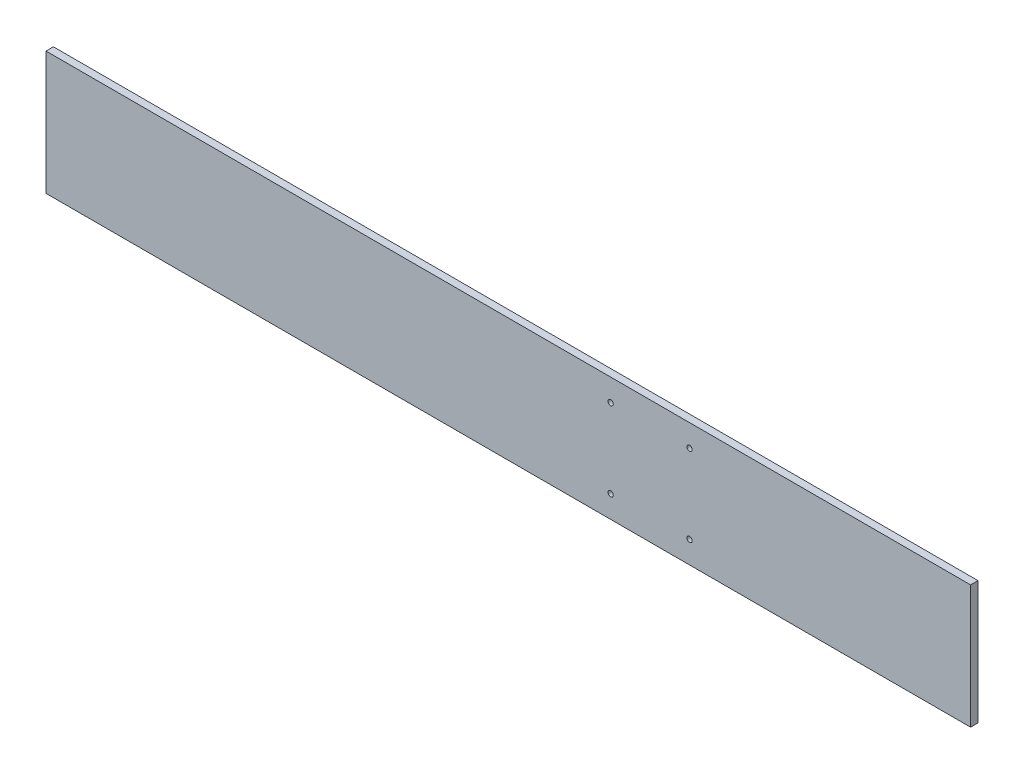
ISO-10303-21;
HEADER;
FILE_DESCRIPTION(('STEP AP214'),'2;1');
FILE_NAME('part.step','',(''),(''),'','','');
FILE_SCHEMA(('AUTOMOTIVE_DESIGN { 1 0 10303 214 1 1 1 1 }'));
ENDSEC;
DATA;
#1=APPLICATION_CONTEXT('core data for automotive mechanical design processes');
#2=APPLICATION_PROTOCOL_DEFINITION('international standard','automotive_design',2000,#1);
#3=PRODUCT_CONTEXT('',#1,'mechanical');
#4=PRODUCT('Part','Part','',(#3));
#5=PRODUCT_RELATED_PRODUCT_CATEGORY('part','',(#4));
#6=PRODUCT_DEFINITION_FORMATION('','',#4);
#7=PRODUCT_DEFINITION_CONTEXT('part definition',#1,'design');
#8=PRODUCT_DEFINITION('design','',#6,#7);
#9=PRODUCT_DEFINITION_SHAPE('','',#8);
#10=(LENGTH_UNIT() NAMED_UNIT(*) SI_UNIT(.MILLI.,.METRE.));
#11=(NAMED_UNIT(*) PLANE_ANGLE_UNIT() SI_UNIT($,.RADIAN.));
#12=(NAMED_UNIT(*) SI_UNIT($,.STERADIAN.) SOLID_ANGLE_UNIT());
#13=UNCERTAINTY_MEASURE_WITH_UNIT(LENGTH_MEASURE(1.E-05),#10,'distance_accuracy_value','');
#14=(GEOMETRIC_REPRESENTATION_CONTEXT(3) GLOBAL_UNCERTAINTY_ASSIGNED_CONTEXT((#13)) GLOBAL_UNIT_ASSIGNED_CONTEXT((#10,
#11,#12)) REPRESENTATION_CONTEXT('',''));
#15=CARTESIAN_POINT('',(0.,0.,0.));
#16=DIRECTION('',(0.,0.,1.));
#17=DIRECTION('',(1.,0.,0.));
#18=AXIS2_PLACEMENT_3D('',#15,#16,#17);
#19=CARTESIAN_POINT('',(375.,-50.,6.));
#20=DIRECTION('',(-1.,0.,0.));
#21=DIRECTION('',(0.,0.,1.));
#22=AXIS2_PLACEMENT_3D('',#19,#20,#21);
#23=PLANE('',#22);
#24=DIRECTION('',(0.,1.,0.));
#25=VECTOR('',#24,1.);
#26=CARTESIAN_POINT('',(375.,-50.,0.));
#27=LINE('',#26,#25);
#28=CARTESIAN_POINT('',(375.,-50.,0.));
#29=VERTEX_POINT('',#28);
#30=CARTESIAN_POINT('',(375.,50.,0.));
#31=VERTEX_POINT('',#30);
#32=EDGE_CURVE('E99',#29,#31,#27,.T.);
#33=ORIENTED_EDGE('',*,*,#32,.T.);
#34=DIRECTION('',(0.,0.,-1.));
#35=VECTOR('',#34,1.);
#36=CARTESIAN_POINT('',(375.,50.,6.));
#37=LINE('',#36,#35);
#38=CARTESIAN_POINT('',(375.,50.,6.));
#39=VERTEX_POINT('',#38);
#40=EDGE_CURVE('E11',#39,#31,#37,.T.);
#41=ORIENTED_EDGE('',*,*,#40,.F.);
#42=DIRECTION('',(0.,1.,0.));
#43=VECTOR('',#42,1.);
#44=CARTESIAN_POINT('',(375.,-50.,6.));
#45=LINE('',#44,#43);
#46=CARTESIAN_POINT('',(375.,-50.,6.));
#47=VERTEX_POINT('',#46);
#48=EDGE_CURVE('E86',#47,#39,#45,.T.);
#49=ORIENTED_EDGE('',*,*,#48,.F.);
#50=DIRECTION('',(0.,0.,-1.));
#51=VECTOR('',#50,1.);
#52=CARTESIAN_POINT('',(375.,-50.,6.));
#53=LINE('',#52,#51);
#54=EDGE_CURVE('E95',#47,#29,#53,.T.);
#55=ORIENTED_EDGE('',*,*,#54,.T.);
#56=EDGE_LOOP('',(#33,#41,#49,#55));
#57=FACE_BOUND('',#56,.T.);
#58=ADVANCED_FACE('F33',(#57),#23,.F.);
#59=CARTESIAN_POINT('',(-375.,50.,6.));
#60=DIRECTION('',(0.,-1.,0.));
#61=DIRECTION('',(0.,0.,-1.));
#62=AXIS2_PLACEMENT_3D('',#59,#60,#61);
#63=PLANE('',#62);
#64=DIRECTION('',(-1.,0.,0.));
#65=VECTOR('',#64,1.);
#66=CARTESIAN_POINT('',(-375.,50.,0.));
#67=LINE('',#66,#65);
#68=CARTESIAN_POINT('',(-375.,50.,0.));
#69=VERTEX_POINT('',#68);
#70=EDGE_CURVE('E90',#31,#69,#67,.T.);
#71=ORIENTED_EDGE('',*,*,#70,.T.);
#72=DIRECTION('',(0.,0.,-1.));
#73=VECTOR('',#72,1.);
#74=CARTESIAN_POINT('',(-375.,50.,6.));
#75=LINE('',#74,#73);
#76=CARTESIAN_POINT('',(-375.,50.,6.));
#77=VERTEX_POINT('',#76);
#78=EDGE_CURVE('E42',#77,#69,#75,.T.);
#79=ORIENTED_EDGE('',*,*,#78,.F.);
#80=DIRECTION('',(-1.,0.,0.));
#81=VECTOR('',#80,1.);
#82=CARTESIAN_POINT('',(-375.,50.,6.));
#83=LINE('',#82,#81);
#84=EDGE_CURVE('E81',#39,#77,#83,.T.);
#85=ORIENTED_EDGE('',*,*,#84,.F.);
#86=ORIENTED_EDGE('',*,*,#40,.T.);
#87=EDGE_LOOP('',(#71,#79,#85,#86));
#88=FACE_BOUND('',#87,.T.);
#89=ADVANCED_FACE('F89',(#88),#63,.F.);
#90=CARTESIAN_POINT('',(-375.,-50.,6.));
#91=DIRECTION('',(1.,0.,0.));
#92=DIRECTION('',(0.,0.,-1.));
#93=AXIS2_PLACEMENT_3D('',#90,#91,#92);
#94=PLANE('',#93);
#95=DIRECTION('',(0.,-1.,0.));
#96=VECTOR('',#95,1.);
#97=CARTESIAN_POINT('',(-375.,-50.,0.));
#98=LINE('',#97,#96);
#99=CARTESIAN_POINT('',(-375.,-50.,0.));
#100=VERTEX_POINT('',#99);
#101=EDGE_CURVE('E68',#69,#100,#98,.T.);
#102=ORIENTED_EDGE('',*,*,#101,.T.);
#103=DIRECTION('',(0.,0.,-1.));
#104=VECTOR('',#103,1.);
#105=CARTESIAN_POINT('',(-375.,-50.,6.));
#106=LINE('',#105,#104);
#107=CARTESIAN_POINT('',(-375.,-50.,6.));
#108=VERTEX_POINT('',#107);
#109=EDGE_CURVE('E91',#108,#100,#106,.T.);
#110=ORIENTED_EDGE('',*,*,#109,.F.);
#111=DIRECTION('',(0.,-1.,0.));
#112=VECTOR('',#111,1.);
#113=CARTESIAN_POINT('',(-375.,-50.,6.));
#114=LINE('',#113,#112);
#115=EDGE_CURVE('E84',#77,#108,#114,.T.);
#116=ORIENTED_EDGE('',*,*,#115,.F.);
#117=ORIENTED_EDGE('',*,*,#78,.T.);
#118=EDGE_LOOP('',(#102,#110,#116,#117));
#119=FACE_BOUND('',#118,.T.);
#120=ADVANCED_FACE('F93',(#119),#94,.F.);
#121=CARTESIAN_POINT('',(-375.,-50.,6.));
#122=DIRECTION('',(0.,1.,0.));
#123=DIRECTION('',(0.,0.,1.));
#124=AXIS2_PLACEMENT_3D('',#121,#122,#123);
#125=PLANE('',#124);
#126=DIRECTION('',(1.,0.,0.));
#127=VECTOR('',#126,1.);
#128=CARTESIAN_POINT('',(-375.,-50.,0.));
#129=LINE('',#128,#127);
#130=EDGE_CURVE('E74',#100,#29,#129,.T.);
#131=ORIENTED_EDGE('',*,*,#130,.T.);
#132=ORIENTED_EDGE('',*,*,#54,.F.);
#133=DIRECTION('',(1.,0.,0.));
#134=VECTOR('',#133,1.);
#135=CARTESIAN_POINT('',(-375.,-50.,6.));
#136=LINE('',#135,#134);
#137=EDGE_CURVE('E51',#108,#47,#136,.T.);
#138=ORIENTED_EDGE('',*,*,#137,.F.);
#139=ORIENTED_EDGE('',*,*,#109,.T.);
#140=EDGE_LOOP('',(#131,#132,#138,#139));
#141=FACE_BOUND('',#140,.T.);
#142=ADVANCED_FACE('F142',(#141),#125,.F.);
#143=CARTESIAN_POINT('',(0.,0.,6.));
#144=DIRECTION('',(0.,0.,-1.));
#145=DIRECTION('',(-1.,0.,0.));
#146=AXIS2_PLACEMENT_3D('',#143,#144,#145);
#147=PLANE('',#146);
#148=CARTESIAN_POINT('',(146.99999999998,31.9999999985103,6.));
#149=DIRECTION('',(0.,0.,-1.));
#150=DIRECTION('',(-1.,0.,0.));
#151=AXIS2_PLACEMENT_3D('',#148,#149,#150);
#152=CIRCLE('',#151,2.14999999999999);
#153=CARTESIAN_POINT('',(144.84999999998,31.9999999985103,6.));
#154=VERTEX_POINT('',#153);
#155=EDGE_CURVE('E124',#154,#154,#152,.T.);
#156=ORIENTED_EDGE('',*,*,#155,.T.);
#157=EDGE_LOOP('',(#156));
#158=FACE_BOUND('',#157,.T.);
#159=CARTESIAN_POINT('',(146.99999999998,-32.0000000014897,6.));
#160=DIRECTION('',(0.,0.,-1.));
#161=DIRECTION('',(-1.,0.,0.));
#162=AXIS2_PLACEMENT_3D('',#159,#160,#161);
#163=CIRCLE('',#162,2.14999999999999);
#164=CARTESIAN_POINT('',(144.84999999998,-32.0000000014897,6.));
#165=VERTEX_POINT('',#164);
#166=EDGE_CURVE('E114',#165,#165,#163,.T.);
#167=ORIENTED_EDGE('',*,*,#166,.T.);
#168=EDGE_LOOP('',(#167));
#169=FACE_BOUND('',#168,.T.);
#170=CARTESIAN_POINT('',(82.9999999999803,31.9999999985103,6.));
#171=DIRECTION('',(0.,0.,-1.));
#172=DIRECTION('',(-1.,0.,0.));
#173=AXIS2_PLACEMENT_3D('',#170,#171,#172);
#174=CIRCLE('',#173,2.15);
#175=CARTESIAN_POINT('',(80.8499999999803,31.9999999985103,6.));
#176=VERTEX_POINT('',#175);
#177=EDGE_CURVE('E111',#176,#176,#174,.T.);
#178=ORIENTED_EDGE('',*,*,#177,.T.);
#179=EDGE_LOOP('',(#178));
#180=FACE_BOUND('',#179,.T.);
#181=CARTESIAN_POINT('',(82.9999999999803,-32.0000000014897,6.));
#182=DIRECTION('',(0.,0.,-1.));
#183=DIRECTION('',(-1.,0.,0.));
#184=AXIS2_PLACEMENT_3D('',#181,#182,#183);
#185=CIRCLE('',#184,2.15);
#186=CARTESIAN_POINT('',(80.8499999999803,-32.0000000014897,6.));
#187=VERTEX_POINT('',#186);
#188=EDGE_CURVE('E110',#187,#187,#185,.T.);
#189=ORIENTED_EDGE('',*,*,#188,.T.);
#190=EDGE_LOOP('',(#189));
#191=FACE_BOUND('',#190,.T.);
#192=ORIENTED_EDGE('',*,*,#48,.T.);
#193=ORIENTED_EDGE('',*,*,#84,.T.);
#194=ORIENTED_EDGE('',*,*,#115,.T.);
#195=ORIENTED_EDGE('',*,*,#137,.T.);
#196=EDGE_LOOP('',(#192,#193,#194,#195));
#197=FACE_BOUND('',#196,.T.);
#198=ADVANCED_FACE('F82',(#158,#169,#180,#191,#197),#147,.F.);
#199=CARTESIAN_POINT('',(0.,0.,0.));
#200=DIRECTION('',(0.,0.,-1.));
#201=DIRECTION('',(-1.,0.,0.));
#202=AXIS2_PLACEMENT_3D('',#199,#200,#201);
#203=PLANE('',#202);
#204=CARTESIAN_POINT('',(146.99999999998,31.9999999985103,0.));
#205=DIRECTION('',(0.,0.,-1.));
#206=DIRECTION('',(-1.,0.,0.));
#207=AXIS2_PLACEMENT_3D('',#204,#205,#206);
#208=CIRCLE('',#207,2.15);
#209=CARTESIAN_POINT('',(144.84999999998,31.9999999985103,0.));
#210=VERTEX_POINT('',#209);
#211=EDGE_CURVE('E36',#210,#210,#208,.T.);
#212=ORIENTED_EDGE('',*,*,#211,.F.);
#213=EDGE_LOOP('',(#212));
#214=FACE_BOUND('',#213,.T.);
#215=CARTESIAN_POINT('',(146.99999999998,-32.0000000014897,0.));
#216=DIRECTION('',(0.,0.,-1.));
#217=DIRECTION('',(-1.,0.,0.));
#218=AXIS2_PLACEMENT_3D('',#215,#216,#217);
#219=CIRCLE('',#218,2.15);
#220=CARTESIAN_POINT('',(144.84999999998,-32.0000000014897,0.));
#221=VERTEX_POINT('',#220);
#222=EDGE_CURVE('E112',#221,#221,#219,.T.);
#223=ORIENTED_EDGE('',*,*,#222,.F.);
#224=EDGE_LOOP('',(#223));
#225=FACE_BOUND('',#224,.T.);
#226=CARTESIAN_POINT('',(82.9999999999803,31.9999999985103,0.));
#227=DIRECTION('',(0.,0.,-1.));
#228=DIRECTION('',(-1.,0.,0.));
#229=AXIS2_PLACEMENT_3D('',#226,#227,#228);
#230=CIRCLE('',#229,2.15);
#231=CARTESIAN_POINT('',(80.8499999999803,31.9999999985103,0.));
#232=VERTEX_POINT('',#231);
#233=EDGE_CURVE('E108',#232,#232,#230,.T.);
#234=ORIENTED_EDGE('',*,*,#233,.F.);
#235=EDGE_LOOP('',(#234));
#236=FACE_BOUND('',#235,.T.);
#237=CARTESIAN_POINT('',(82.9999999999803,-32.0000000014897,0.));
#238=DIRECTION('',(0.,0.,-1.));
#239=DIRECTION('',(-1.,0.,0.));
#240=AXIS2_PLACEMENT_3D('',#237,#238,#239);
#241=CIRCLE('',#240,2.15);
#242=CARTESIAN_POINT('',(80.8499999999803,-32.0000000014897,0.));
#243=VERTEX_POINT('',#242);
#244=EDGE_CURVE('E102',#243,#243,#241,.T.);
#245=ORIENTED_EDGE('',*,*,#244,.F.);
#246=EDGE_LOOP('',(#245));
#247=FACE_BOUND('',#246,.T.);
#248=ORIENTED_EDGE('',*,*,#32,.F.);
#249=ORIENTED_EDGE('',*,*,#130,.F.);
#250=ORIENTED_EDGE('',*,*,#101,.F.);
#251=ORIENTED_EDGE('',*,*,#70,.F.);
#252=EDGE_LOOP('',(#248,#249,#250,#251));
#253=FACE_BOUND('',#252,.T.);
#254=ADVANCED_FACE('F135',(#214,#225,#236,#247,#253),#203,.T.);
#255=CARTESIAN_POINT('',(82.9999999999803,-32.0000000014897,-2.99999999993283));
#256=DIRECTION('',(0.,0.,-1.));
#257=DIRECTION('',(-1.,0.,0.));
#258=AXIS2_PLACEMENT_3D('',#255,#256,#257);
#259=CYLINDRICAL_SURFACE('',#258,2.15);
#260=ORIENTED_EDGE('',*,*,#244,.T.);
#261=EDGE_LOOP('',(#260));
#262=FACE_BOUND('',#261,.T.);
#263=ORIENTED_EDGE('',*,*,#188,.F.);
#264=EDGE_LOOP('',(#263));
#265=FACE_BOUND('',#264,.T.);
#266=ADVANCED_FACE('F132',(#262,#265),#259,.F.);
#267=CARTESIAN_POINT('',(82.9999999999803,31.9999999985103,-2.99999999993283));
#268=DIRECTION('',(0.,0.,-1.));
#269=DIRECTION('',(-1.,0.,0.));
#270=AXIS2_PLACEMENT_3D('',#267,#268,#269);
#271=CYLINDRICAL_SURFACE('',#270,2.15);
#272=ORIENTED_EDGE('',*,*,#233,.T.);
#273=EDGE_LOOP('',(#272));
#274=FACE_BOUND('',#273,.T.);
#275=ORIENTED_EDGE('',*,*,#177,.F.);
#276=EDGE_LOOP('',(#275));
#277=FACE_BOUND('',#276,.T.);
#278=ADVANCED_FACE('F176',(#274,#277),#271,.F.);
#279=CARTESIAN_POINT('',(146.99999999998,-32.0000000014897,-2.99999999993283));
#280=DIRECTION('',(0.,0.,-1.));
#281=DIRECTION('',(-1.,0.,0.));
#282=AXIS2_PLACEMENT_3D('',#279,#280,#281);
#283=CYLINDRICAL_SURFACE('',#282,2.15);
#284=ORIENTED_EDGE('',*,*,#222,.T.);
#285=EDGE_LOOP('',(#284));
#286=FACE_BOUND('',#285,.T.);
#287=ORIENTED_EDGE('',*,*,#166,.F.);
#288=EDGE_LOOP('',(#287));
#289=FACE_BOUND('',#288,.T.);
#290=ADVANCED_FACE('F192',(#286,#289),#283,.F.);
#291=CARTESIAN_POINT('',(146.99999999998,31.9999999985103,-2.99999999993283));
#292=DIRECTION('',(0.,0.,-1.));
#293=DIRECTION('',(-1.,0.,0.));
#294=AXIS2_PLACEMENT_3D('',#291,#292,#293);
#295=CYLINDRICAL_SURFACE('',#294,2.15);
#296=ORIENTED_EDGE('',*,*,#211,.T.);
#297=EDGE_LOOP('',(#296));
#298=FACE_BOUND('',#297,.T.);
#299=ORIENTED_EDGE('',*,*,#155,.F.);
#300=EDGE_LOOP('',(#299));
#301=FACE_BOUND('',#300,.T.);
#302=ADVANCED_FACE('F202',(#298,#301),#295,.F.);
#303=CLOSED_SHELL('',(#58,#89,#120,#142,#198,#254,#266,#278,#290,#302));
#304=MANIFOLD_SOLID_BREP('B2',#303);
#305=ADVANCED_BREP_SHAPE_REPRESENTATION('',(#18,#304),#14);
#306=SHAPE_DEFINITION_REPRESENTATION(#9,#305);
ENDSEC;
END-ISO-10303-21;
